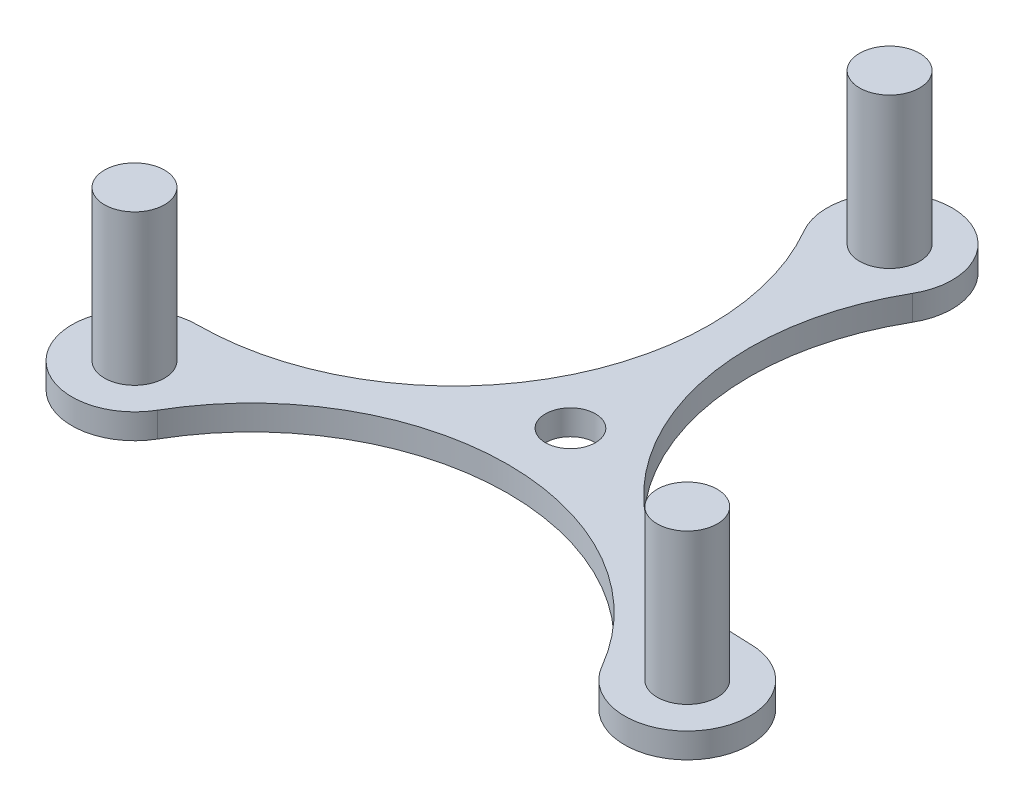
ISO-10303-21;
HEADER;
FILE_DESCRIPTION(('STEP AP214'),'2;1');
FILE_NAME('part.step','',(''),(''),'','','');
FILE_SCHEMA(('AUTOMOTIVE_DESIGN { 1 0 10303 214 1 1 1 1 }'));
ENDSEC;
DATA;
#1=APPLICATION_CONTEXT('core data for automotive mechanical design processes');
#2=APPLICATION_PROTOCOL_DEFINITION('international standard','automotive_design',2000,#1);
#3=PRODUCT_CONTEXT('',#1,'mechanical');
#4=PRODUCT('Part','Part','',(#3));
#5=PRODUCT_RELATED_PRODUCT_CATEGORY('part','',(#4));
#6=PRODUCT_DEFINITION_FORMATION('','',#4);
#7=PRODUCT_DEFINITION_CONTEXT('part definition',#1,'design');
#8=PRODUCT_DEFINITION('design','',#6,#7);
#9=PRODUCT_DEFINITION_SHAPE('','',#8);
#10=(LENGTH_UNIT() NAMED_UNIT(*) SI_UNIT(.MILLI.,.METRE.));
#11=(NAMED_UNIT(*) PLANE_ANGLE_UNIT() SI_UNIT($,.RADIAN.));
#12=(NAMED_UNIT(*) SI_UNIT($,.STERADIAN.) SOLID_ANGLE_UNIT());
#13=UNCERTAINTY_MEASURE_WITH_UNIT(LENGTH_MEASURE(1.E-05),#10,'distance_accuracy_value','');
#14=(GEOMETRIC_REPRESENTATION_CONTEXT(3) GLOBAL_UNCERTAINTY_ASSIGNED_CONTEXT((#13)) GLOBAL_UNIT_ASSIGNED_CONTEXT((#10,
#11,#12)) REPRESENTATION_CONTEXT('',''));
#15=CARTESIAN_POINT('',(0.,0.,0.));
#16=DIRECTION('',(0.,0.,1.));
#17=DIRECTION('',(1.,0.,0.));
#18=AXIS2_PLACEMENT_3D('',#15,#16,#17);
#19=CARTESIAN_POINT('',(0.,2.,25.5000000000001));
#20=DIRECTION('',(0.,-1.,0.));
#21=DIRECTION('',(0.,0.,-1.));
#22=AXIS2_PLACEMENT_3D('',#19,#20,#21);
#23=CYLINDRICAL_SURFACE('',#22,20.5000000000001);
#24=CARTESIAN_POINT('',(0.,0.,25.5000000000001));
#25=DIRECTION('',(0.,1.,0.));
#26=DIRECTION('',(0.,0.,1.));
#27=AXIS2_PLACEMENT_3D('',#24,#25,#26);
#28=CIRCLE('',#27,20.5000000000001);
#29=CARTESIAN_POINT('',(17.753520777581,0.,15.25));
#30=VERTEX_POINT('',#29);
#31=CARTESIAN_POINT('',(-17.753520777581,0.,15.25));
#32=VERTEX_POINT('',#31);
#33=EDGE_CURVE('E124',#30,#32,#28,.T.);
#34=ORIENTED_EDGE('',*,*,#33,.F.);
#35=DIRECTION('',(0.,-1.,0.));
#36=VECTOR('',#35,1.);
#37=CARTESIAN_POINT('',(17.753520777581,2.,15.25));
#38=LINE('',#37,#36);
#39=CARTESIAN_POINT('',(17.753520777581,2.,15.25));
#40=VERTEX_POINT('',#39);
#41=EDGE_CURVE('E11',#40,#30,#38,.T.);
#42=ORIENTED_EDGE('',*,*,#41,.F.);
#43=CARTESIAN_POINT('',(0.,2.,25.5000000000001));
#44=DIRECTION('',(0.,1.,0.));
#45=DIRECTION('',(0.,0.,1.));
#46=AXIS2_PLACEMENT_3D('',#43,#44,#45);
#47=CIRCLE('',#46,20.5000000000001);
#48=CARTESIAN_POINT('',(-17.753520777581,2.,15.25));
#49=VERTEX_POINT('',#48);
#50=EDGE_CURVE('E152',#40,#49,#47,.T.);
#51=ORIENTED_EDGE('',*,*,#50,.T.);
#52=DIRECTION('',(0.,-1.,0.));
#53=VECTOR('',#52,1.);
#54=CARTESIAN_POINT('',(-17.753520777581,2.,15.25));
#55=LINE('',#54,#53);
#56=EDGE_CURVE('E84',#49,#32,#55,.T.);
#57=ORIENTED_EDGE('',*,*,#56,.T.);
#58=EDGE_LOOP('',(#34,#42,#51,#57));
#59=FACE_BOUND('',#58,.T.);
#60=ADVANCED_FACE('F39',(#59),#23,.F.);
#61=CARTESIAN_POINT('',(22.0836477965032,2.,12.7499999999999));
#62=DIRECTION('',(0.,-1.,0.));
#63=DIRECTION('',(0.,0.,-1.));
#64=AXIS2_PLACEMENT_3D('',#61,#62,#63);
#65=CYLINDRICAL_SURFACE('',#64,5.);
#66=CARTESIAN_POINT('',(22.0836477965032,0.,12.7499999999999));
#67=DIRECTION('',(0.,1.,0.));
#68=DIRECTION('',(0.,0.,1.));
#69=AXIS2_PLACEMENT_3D('',#66,#67,#68);
#70=CIRCLE('',#69,5.);
#71=CARTESIAN_POINT('',(22.0836477965032,0.,7.74999999999994));
#72=VERTEX_POINT('',#71);
#73=EDGE_CURVE('E128',#30,#72,#70,.T.);
#74=ORIENTED_EDGE('',*,*,#73,.T.);
#75=DIRECTION('',(0.,-1.,0.));
#76=VECTOR('',#75,1.);
#77=CARTESIAN_POINT('',(22.0836477965032,2.,7.74999999999994));
#78=LINE('',#77,#76);
#79=CARTESIAN_POINT('',(22.0836477965032,2.,7.74999999999994));
#80=VERTEX_POINT('',#79);
#81=EDGE_CURVE('E48',#80,#72,#78,.T.);
#82=ORIENTED_EDGE('',*,*,#81,.F.);
#83=CARTESIAN_POINT('',(22.0836477965032,2.,12.7499999999999));
#84=DIRECTION('',(0.,1.,0.));
#85=DIRECTION('',(0.,0.,1.));
#86=AXIS2_PLACEMENT_3D('',#83,#84,#85);
#87=CIRCLE('',#86,5.);
#88=EDGE_CURVE('E153',#40,#80,#87,.T.);
#89=ORIENTED_EDGE('',*,*,#88,.F.);
#90=ORIENTED_EDGE('',*,*,#41,.T.);
#91=EDGE_LOOP('',(#74,#82,#89,#90));
#92=FACE_BOUND('',#91,.T.);
#93=ADVANCED_FACE('F148',(#92),#65,.T.);
#94=CARTESIAN_POINT('',(22.0836477965031,2.,-12.75));
#95=DIRECTION('',(0.,-1.,0.));
#96=DIRECTION('',(0.,0.,-1.));
#97=AXIS2_PLACEMENT_3D('',#94,#95,#96);
#98=CYLINDRICAL_SURFACE('',#97,20.4999999999999);
#99=CARTESIAN_POINT('',(22.0836477965031,0.,-12.75));
#100=DIRECTION('',(0.,1.,0.));
#101=DIRECTION('',(0.,0.,1.));
#102=AXIS2_PLACEMENT_3D('',#99,#100,#101);
#103=CIRCLE('',#102,20.4999999999999);
#104=CARTESIAN_POINT('',(4.33012701892219,0.,-23.));
#105=VERTEX_POINT('',#104);
#106=EDGE_CURVE('E131',#105,#72,#103,.T.);
#107=ORIENTED_EDGE('',*,*,#106,.F.);
#108=DIRECTION('',(0.,-1.,0.));
#109=VECTOR('',#108,1.);
#110=CARTESIAN_POINT('',(4.33012701892219,2.,-23.));
#111=LINE('',#110,#109);
#112=CARTESIAN_POINT('',(4.33012701892219,2.,-23.));
#113=VERTEX_POINT('',#112);
#114=EDGE_CURVE('E114',#113,#105,#111,.T.);
#115=ORIENTED_EDGE('',*,*,#114,.F.);
#116=CARTESIAN_POINT('',(22.0836477965031,2.,-12.75));
#117=DIRECTION('',(0.,1.,0.));
#118=DIRECTION('',(0.,0.,1.));
#119=AXIS2_PLACEMENT_3D('',#116,#117,#118);
#120=CIRCLE('',#119,20.4999999999999);
#121=EDGE_CURVE('E103',#113,#80,#120,.T.);
#122=ORIENTED_EDGE('',*,*,#121,.T.);
#123=ORIENTED_EDGE('',*,*,#81,.T.);
#124=EDGE_LOOP('',(#107,#115,#122,#123));
#125=FACE_BOUND('',#124,.T.);
#126=ADVANCED_FACE('F145',(#125),#98,.F.);
#127=CARTESIAN_POINT('',(0.,2.,-25.5));
#128=DIRECTION('',(0.,-1.,0.));
#129=DIRECTION('',(0.,0.,-1.));
#130=AXIS2_PLACEMENT_3D('',#127,#128,#129);
#131=CYLINDRICAL_SURFACE('',#130,5.);
#132=CARTESIAN_POINT('',(0.,0.,-25.5));
#133=DIRECTION('',(0.,1.,0.));
#134=DIRECTION('',(0.,0.,1.));
#135=AXIS2_PLACEMENT_3D('',#132,#133,#134);
#136=CIRCLE('',#135,5.);
#137=CARTESIAN_POINT('',(-4.33012701892219,0.,-23.));
#138=VERTEX_POINT('',#137);
#139=EDGE_CURVE('E110',#105,#138,#136,.T.);
#140=ORIENTED_EDGE('',*,*,#139,.T.);
#141=DIRECTION('',(0.,-1.,0.));
#142=VECTOR('',#141,1.);
#143=CARTESIAN_POINT('',(-4.33012701892219,2.,-23.));
#144=LINE('',#143,#142);
#145=CARTESIAN_POINT('',(-4.33012701892219,2.,-23.));
#146=VERTEX_POINT('',#145);
#147=EDGE_CURVE('E107',#146,#138,#144,.T.);
#148=ORIENTED_EDGE('',*,*,#147,.F.);
#149=CARTESIAN_POINT('',(0.,2.,-25.5));
#150=DIRECTION('',(0.,1.,0.));
#151=DIRECTION('',(0.,0.,1.));
#152=AXIS2_PLACEMENT_3D('',#149,#150,#151);
#153=CIRCLE('',#152,5.);
#154=EDGE_CURVE('E97',#113,#146,#153,.T.);
#155=ORIENTED_EDGE('',*,*,#154,.F.);
#156=ORIENTED_EDGE('',*,*,#114,.T.);
#157=EDGE_LOOP('',(#140,#148,#155,#156));
#158=FACE_BOUND('',#157,.T.);
#159=ADVANCED_FACE('F108',(#158),#131,.T.);
#160=CARTESIAN_POINT('',(-22.0836477965031,2.,-12.75));
#161=DIRECTION('',(0.,-1.,0.));
#162=DIRECTION('',(0.,0.,-1.));
#163=AXIS2_PLACEMENT_3D('',#160,#161,#162);
#164=CYLINDRICAL_SURFACE('',#163,20.4999999999999);
#165=CARTESIAN_POINT('',(-22.0836477965031,0.,-12.75));
#166=DIRECTION('',(0.,1.,0.));
#167=DIRECTION('',(0.,0.,1.));
#168=AXIS2_PLACEMENT_3D('',#165,#166,#167);
#169=CIRCLE('',#168,20.4999999999999);
#170=CARTESIAN_POINT('',(-22.0836477965032,0.,7.74999999999994));
#171=VERTEX_POINT('',#170);
#172=EDGE_CURVE('E135',#171,#138,#169,.T.);
#173=ORIENTED_EDGE('',*,*,#172,.F.);
#174=DIRECTION('',(0.,-1.,0.));
#175=VECTOR('',#174,1.);
#176=CARTESIAN_POINT('',(-22.0836477965032,2.,7.74999999999994));
#177=LINE('',#176,#175);
#178=CARTESIAN_POINT('',(-22.0836477965032,2.,7.74999999999994));
#179=VERTEX_POINT('',#178);
#180=EDGE_CURVE('E77',#179,#171,#177,.T.);
#181=ORIENTED_EDGE('',*,*,#180,.F.);
#182=CARTESIAN_POINT('',(-22.0836477965031,2.,-12.75));
#183=DIRECTION('',(0.,1.,0.));
#184=DIRECTION('',(0.,0.,1.));
#185=AXIS2_PLACEMENT_3D('',#182,#183,#184);
#186=CIRCLE('',#185,20.4999999999999);
#187=EDGE_CURVE('E101',#179,#146,#186,.T.);
#188=ORIENTED_EDGE('',*,*,#187,.T.);
#189=ORIENTED_EDGE('',*,*,#147,.T.);
#190=EDGE_LOOP('',(#173,#181,#188,#189));
#191=FACE_BOUND('',#190,.T.);
#192=ADVANCED_FACE('F116',(#191),#164,.F.);
#193=CARTESIAN_POINT('',(0.,2.,0.));
#194=DIRECTION('',(0.,-1.,0.));
#195=DIRECTION('',(0.,0.,-1.));
#196=AXIS2_PLACEMENT_3D('',#193,#194,#195);
#197=CYLINDRICAL_SURFACE('',#196,2.);
#198=CARTESIAN_POINT('',(0.,2.,0.));
#199=DIRECTION('',(0.,1.,0.));
#200=DIRECTION('',(0.,0.,1.));
#201=AXIS2_PLACEMENT_3D('',#198,#199,#200);
#202=CIRCLE('',#201,2.);
#203=CARTESIAN_POINT('',(0.,2.,2.));
#204=VERTEX_POINT('',#203);
#205=EDGE_CURVE('E139',#204,#204,#202,.T.);
#206=ORIENTED_EDGE('',*,*,#205,.T.);
#207=EDGE_LOOP('',(#206));
#208=FACE_BOUND('',#207,.T.);
#209=CARTESIAN_POINT('',(0.,0.,0.));
#210=DIRECTION('',(0.,1.,0.));
#211=DIRECTION('',(0.,0.,1.));
#212=AXIS2_PLACEMENT_3D('',#209,#210,#211);
#213=CIRCLE('',#212,2.);
#214=CARTESIAN_POINT('',(0.,0.,2.));
#215=VERTEX_POINT('',#214);
#216=EDGE_CURVE('E121',#215,#215,#213,.T.);
#217=ORIENTED_EDGE('',*,*,#216,.F.);
#218=EDGE_LOOP('',(#217));
#219=FACE_BOUND('',#218,.T.);
#220=ADVANCED_FACE('F41',(#208,#219),#197,.F.);
#221=CARTESIAN_POINT('',(-22.0836477965032,2.,12.7499999999999));
#222=DIRECTION('',(0.,-1.,0.));
#223=DIRECTION('',(0.,0.,-1.));
#224=AXIS2_PLACEMENT_3D('',#221,#222,#223);
#225=CYLINDRICAL_SURFACE('',#224,5.);
#226=CARTESIAN_POINT('',(-22.0836477965032,0.,12.7499999999999));
#227=DIRECTION('',(0.,1.,0.));
#228=DIRECTION('',(0.,0.,1.));
#229=AXIS2_PLACEMENT_3D('',#226,#227,#228);
#230=CIRCLE('',#229,5.);
#231=EDGE_CURVE('E137',#171,#32,#230,.T.);
#232=ORIENTED_EDGE('',*,*,#231,.T.);
#233=ORIENTED_EDGE('',*,*,#56,.F.);
#234=CARTESIAN_POINT('',(-22.0836477965032,2.,12.7499999999999));
#235=DIRECTION('',(0.,1.,0.));
#236=DIRECTION('',(0.,0.,1.));
#237=AXIS2_PLACEMENT_3D('',#234,#235,#236);
#238=CIRCLE('',#237,5.);
#239=EDGE_CURVE('E56',#179,#49,#238,.T.);
#240=ORIENTED_EDGE('',*,*,#239,.F.);
#241=ORIENTED_EDGE('',*,*,#180,.T.);
#242=EDGE_LOOP('',(#232,#233,#240,#241));
#243=FACE_BOUND('',#242,.T.);
#244=ADVANCED_FACE('F151',(#243),#225,.T.);
#245=CARTESIAN_POINT('',(0.,2.,0.));
#246=DIRECTION('',(0.,1.,0.));
#247=DIRECTION('',(0.,0.,1.));
#248=AXIS2_PLACEMENT_3D('',#245,#246,#247);
#249=PLANE('',#248);
#250=CARTESIAN_POINT('',(0.,2.,-25.5));
#251=DIRECTION('',(0.,1.,0.));
#252=DIRECTION('',(0.,0.,1.));
#253=AXIS2_PLACEMENT_3D('',#250,#251,#252);
#254=CIRCLE('',#253,2.4);
#255=CARTESIAN_POINT('',(0.,2.,-23.1));
#256=VERTEX_POINT('',#255);
#257=EDGE_CURVE('E171',#256,#256,#254,.T.);
#258=ORIENTED_EDGE('',*,*,#257,.F.);
#259=EDGE_LOOP('',(#258));
#260=FACE_BOUND('',#259,.T.);
#261=CARTESIAN_POINT('',(22.0836477965032,2.,12.7499999999999));
#262=DIRECTION('',(0.,1.,0.));
#263=DIRECTION('',(0.,0.,1.));
#264=AXIS2_PLACEMENT_3D('',#261,#262,#263);
#265=CIRCLE('',#264,2.4);
#266=CARTESIAN_POINT('',(22.0836477965032,2.,15.1499999999999));
#267=VERTEX_POINT('',#266);
#268=EDGE_CURVE('E165',#267,#267,#265,.T.);
#269=ORIENTED_EDGE('',*,*,#268,.F.);
#270=EDGE_LOOP('',(#269));
#271=FACE_BOUND('',#270,.T.);
#272=CARTESIAN_POINT('',(-22.0836477965032,2.,12.7499999999999));
#273=DIRECTION('',(0.,1.,0.));
#274=DIRECTION('',(0.,0.,1.));
#275=AXIS2_PLACEMENT_3D('',#272,#273,#274);
#276=CIRCLE('',#275,2.4);
#277=CARTESIAN_POINT('',(-22.0836477965032,2.,15.1499999999999));
#278=VERTEX_POINT('',#277);
#279=EDGE_CURVE('E159',#278,#278,#276,.T.);
#280=ORIENTED_EDGE('',*,*,#279,.F.);
#281=EDGE_LOOP('',(#280));
#282=FACE_BOUND('',#281,.T.);
#283=ORIENTED_EDGE('',*,*,#205,.F.);
#284=EDGE_LOOP('',(#283));
#285=FACE_BOUND('',#284,.T.);
#286=ORIENTED_EDGE('',*,*,#50,.F.);
#287=ORIENTED_EDGE('',*,*,#88,.T.);
#288=ORIENTED_EDGE('',*,*,#121,.F.);
#289=ORIENTED_EDGE('',*,*,#154,.T.);
#290=ORIENTED_EDGE('',*,*,#187,.F.);
#291=ORIENTED_EDGE('',*,*,#239,.T.);
#292=EDGE_LOOP('',(#286,#287,#288,#289,#290,#291));
#293=FACE_BOUND('',#292,.T.);
#294=ADVANCED_FACE('F99',(#260,#271,#282,#285,#293),#249,.T.);
#295=CARTESIAN_POINT('',(0.,0.,0.));
#296=DIRECTION('',(0.,1.,0.));
#297=DIRECTION('',(0.,0.,1.));
#298=AXIS2_PLACEMENT_3D('',#295,#296,#297);
#299=PLANE('',#298);
#300=ORIENTED_EDGE('',*,*,#216,.T.);
#301=EDGE_LOOP('',(#300));
#302=FACE_BOUND('',#301,.T.);
#303=ORIENTED_EDGE('',*,*,#33,.T.);
#304=ORIENTED_EDGE('',*,*,#231,.F.);
#305=ORIENTED_EDGE('',*,*,#172,.T.);
#306=ORIENTED_EDGE('',*,*,#139,.F.);
#307=ORIENTED_EDGE('',*,*,#106,.T.);
#308=ORIENTED_EDGE('',*,*,#73,.F.);
#309=EDGE_LOOP('',(#303,#304,#305,#306,#307,#308));
#310=FACE_BOUND('',#309,.T.);
#311=ADVANCED_FACE('F150',(#302,#310),#299,.F.);
#312=CARTESIAN_POINT('',(-22.0836477965032,14.,12.7499999999999));
#313=DIRECTION('',(0.,-1.,0.));
#314=DIRECTION('',(0.,0.,-1.));
#315=AXIS2_PLACEMENT_3D('',#312,#313,#314);
#316=CYLINDRICAL_SURFACE('',#315,2.4);
#317=CARTESIAN_POINT('',(-22.0836477965032,14.,12.7499999999999));
#318=DIRECTION('',(0.,1.,0.));
#319=DIRECTION('',(0.,0.,1.));
#320=AXIS2_PLACEMENT_3D('',#317,#318,#319);
#321=CIRCLE('',#320,2.4);
#322=CARTESIAN_POINT('',(-22.0836477965032,14.,15.1499999999999));
#323=VERTEX_POINT('',#322);
#324=EDGE_CURVE('E125',#323,#323,#321,.T.);
#325=ORIENTED_EDGE('',*,*,#324,.F.);
#326=EDGE_LOOP('',(#325));
#327=FACE_BOUND('',#326,.T.);
#328=ORIENTED_EDGE('',*,*,#279,.T.);
#329=EDGE_LOOP('',(#328));
#330=FACE_BOUND('',#329,.T.);
#331=ADVANCED_FACE('F200',(#327,#330),#316,.T.);
#332=CARTESIAN_POINT('',(-22.0836477965032,14.,12.7499999999999));
#333=DIRECTION('',(0.,1.,0.));
#334=DIRECTION('',(0.,0.,1.));
#335=AXIS2_PLACEMENT_3D('',#332,#333,#334);
#336=PLANE('',#335);
#337=ORIENTED_EDGE('',*,*,#324,.T.);
#338=EDGE_LOOP('',(#337));
#339=FACE_BOUND('',#338,.T.);
#340=ADVANCED_FACE('F205',(#339),#336,.T.);
#341=CARTESIAN_POINT('',(22.0836477965032,14.,12.7499999999999));
#342=DIRECTION('',(0.,-1.,0.));
#343=DIRECTION('',(0.,0.,-1.));
#344=AXIS2_PLACEMENT_3D('',#341,#342,#343);
#345=CYLINDRICAL_SURFACE('',#344,2.4);
#346=CARTESIAN_POINT('',(22.0836477965032,14.,12.7499999999999));
#347=DIRECTION('',(0.,1.,0.));
#348=DIRECTION('',(0.,0.,1.));
#349=AXIS2_PLACEMENT_3D('',#346,#347,#348);
#350=CIRCLE('',#349,2.4);
#351=CARTESIAN_POINT('',(22.0836477965032,14.,15.1499999999999));
#352=VERTEX_POINT('',#351);
#353=EDGE_CURVE('E162',#352,#352,#350,.T.);
#354=ORIENTED_EDGE('',*,*,#353,.F.);
#355=EDGE_LOOP('',(#354));
#356=FACE_BOUND('',#355,.T.);
#357=ORIENTED_EDGE('',*,*,#268,.T.);
#358=EDGE_LOOP('',(#357));
#359=FACE_BOUND('',#358,.T.);
#360=ADVANCED_FACE('F248',(#356,#359),#345,.T.);
#361=CARTESIAN_POINT('',(22.0836477965032,14.,12.7499999999999));
#362=DIRECTION('',(0.,1.,0.));
#363=DIRECTION('',(0.,0.,1.));
#364=AXIS2_PLACEMENT_3D('',#361,#362,#363);
#365=PLANE('',#364);
#366=ORIENTED_EDGE('',*,*,#353,.T.);
#367=EDGE_LOOP('',(#366));
#368=FACE_BOUND('',#367,.T.);
#369=ADVANCED_FACE('F182',(#368),#365,.T.);
#370=CARTESIAN_POINT('',(0.,14.,-25.5));
#371=DIRECTION('',(0.,-1.,0.));
#372=DIRECTION('',(0.,0.,-1.));
#373=AXIS2_PLACEMENT_3D('',#370,#371,#372);
#374=CYLINDRICAL_SURFACE('',#373,2.4);
#375=CARTESIAN_POINT('',(0.,14.,-25.5));
#376=DIRECTION('',(0.,1.,0.));
#377=DIRECTION('',(0.,0.,1.));
#378=AXIS2_PLACEMENT_3D('',#375,#376,#377);
#379=CIRCLE('',#378,2.4);
#380=CARTESIAN_POINT('',(0.,14.,-23.1));
#381=VERTEX_POINT('',#380);
#382=EDGE_CURVE('E168',#381,#381,#379,.T.);
#383=ORIENTED_EDGE('',*,*,#382,.F.);
#384=EDGE_LOOP('',(#383));
#385=FACE_BOUND('',#384,.T.);
#386=ORIENTED_EDGE('',*,*,#257,.T.);
#387=EDGE_LOOP('',(#386));
#388=FACE_BOUND('',#387,.T.);
#389=ADVANCED_FACE('F179',(#385,#388),#374,.T.);
#390=CARTESIAN_POINT('',(0.,14.,-25.5));
#391=DIRECTION('',(0.,1.,0.));
#392=DIRECTION('',(0.,0.,1.));
#393=AXIS2_PLACEMENT_3D('',#390,#391,#392);
#394=PLANE('',#393);
#395=ORIENTED_EDGE('',*,*,#382,.T.);
#396=EDGE_LOOP('',(#395));
#397=FACE_BOUND('',#396,.T.);
#398=ADVANCED_FACE('F177',(#397),#394,.T.);
#399=CLOSED_SHELL('',(#60,#93,#126,#159,#192,#220,#244,#294,#311,#331,#340,#360,#369,#389,#398));
#400=MANIFOLD_SOLID_BREP('B2',#399);
#401=ADVANCED_BREP_SHAPE_REPRESENTATION('',(#18,#400),#14);
#402=SHAPE_DEFINITION_REPRESENTATION(#9,#401);
ENDSEC;
END-ISO-10303-21;
